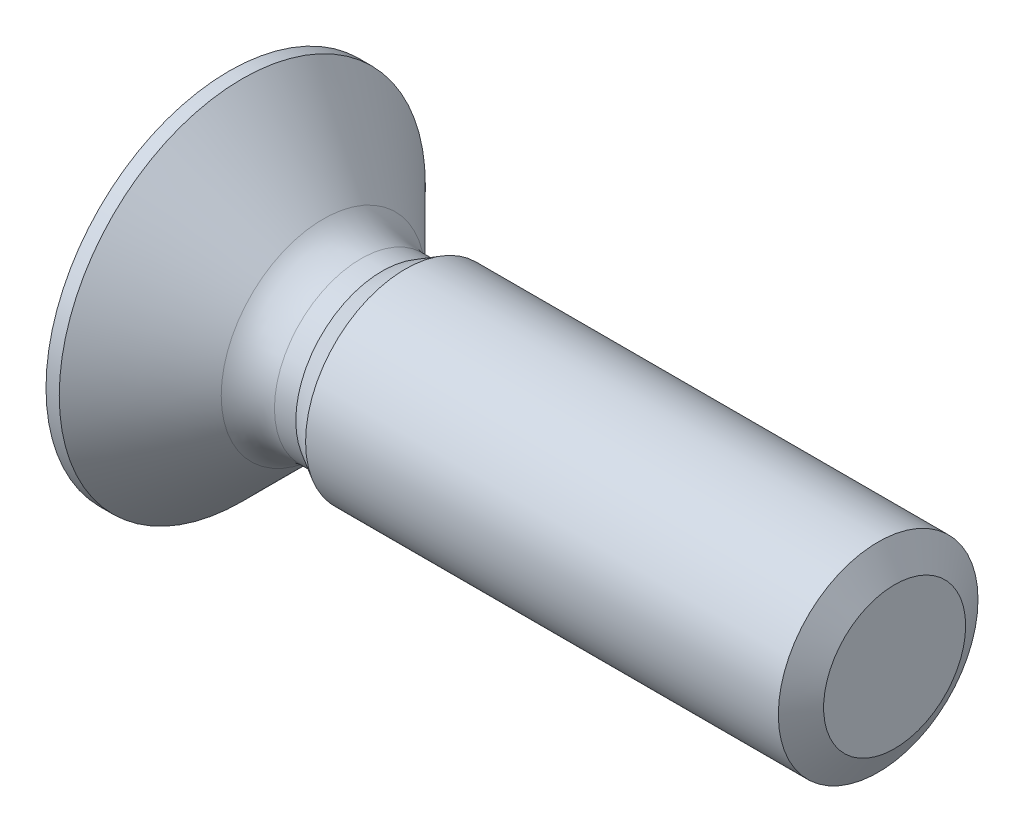
ISO-10303-21;
HEADER;
FILE_DESCRIPTION(('STEP AP214'),'2;1');
FILE_NAME('part.step','',(''),(''),'','','');
FILE_SCHEMA(('AUTOMOTIVE_DESIGN { 1 0 10303 214 1 1 1 1 }'));
ENDSEC;
DATA;
#1=APPLICATION_CONTEXT('core data for automotive mechanical design processes');
#2=APPLICATION_PROTOCOL_DEFINITION('international standard','automotive_design',2000,#1);
#3=PRODUCT_CONTEXT('',#1,'mechanical');
#4=PRODUCT('Part','Part','',(#3));
#5=PRODUCT_RELATED_PRODUCT_CATEGORY('part','',(#4));
#6=PRODUCT_DEFINITION_FORMATION('','',#4);
#7=PRODUCT_DEFINITION_CONTEXT('part definition',#1,'design');
#8=PRODUCT_DEFINITION('design','',#6,#7);
#9=PRODUCT_DEFINITION_SHAPE('','',#8);
#10=(LENGTH_UNIT() NAMED_UNIT(*) SI_UNIT(.MILLI.,.METRE.));
#11=(NAMED_UNIT(*) PLANE_ANGLE_UNIT() SI_UNIT($,.RADIAN.));
#12=(NAMED_UNIT(*) SI_UNIT($,.STERADIAN.) SOLID_ANGLE_UNIT());
#13=UNCERTAINTY_MEASURE_WITH_UNIT(LENGTH_MEASURE(1.E-05),#10,'distance_accuracy_value','');
#14=(GEOMETRIC_REPRESENTATION_CONTEXT(3) GLOBAL_UNCERTAINTY_ASSIGNED_CONTEXT((#13)) GLOBAL_UNIT_ASSIGNED_CONTEXT((#10,
#11,#12)) REPRESENTATION_CONTEXT('',''));
#15=CARTESIAN_POINT('',(0.,0.,0.));
#16=DIRECTION('',(0.,0.,1.));
#17=DIRECTION('',(1.,0.,0.));
#18=AXIS2_PLACEMENT_3D('',#15,#16,#17);
#19=CARTESIAN_POINT('',(0.,0.,0.));
#20=DIRECTION('',(1.,0.,0.));
#21=DIRECTION('',(0.,0.,-1.));
#22=AXIS2_PLACEMENT_3D('',#19,#20,#21);
#23=PLANE('',#22);
#24=CARTESIAN_POINT('',(0.,0.,0.));
#25=DIRECTION('',(-1.,0.,0.));
#26=DIRECTION('',(0.,0.,1.));
#27=AXIS2_PLACEMENT_3D('',#24,#25,#26);
#28=CIRCLE('',#27,2.75);
#29=CARTESIAN_POINT('',(0.,0.,2.75));
#30=VERTEX_POINT('',#29);
#31=EDGE_CURVE('E182',#30,#30,#28,.T.);
#32=ORIENTED_EDGE('',*,*,#31,.T.);
#33=EDGE_LOOP('',(#32));
#34=FACE_BOUND('',#33,.T.);
#35=DIRECTION('',(0.,1.,0.));
#36=VECTOR('',#35,1.);
#37=CARTESIAN_POINT('',(0.,1.6,0.250000000000006));
#38=LINE('',#37,#36);
#39=CARTESIAN_POINT('',(0.,0.25,0.250000000000001));
#40=VERTEX_POINT('',#39);
#41=CARTESIAN_POINT('',(0.,1.6,0.250000000000006));
#42=VERTEX_POINT('',#41);
#43=EDGE_CURVE('E104',#40,#42,#38,.T.);
#44=ORIENTED_EDGE('',*,*,#43,.F.);
#45=DIRECTION('',(0.,0.,-1.));
#46=VECTOR('',#45,1.);
#47=CARTESIAN_POINT('',(0.,0.25,-1.6));
#48=LINE('',#47,#46);
#49=CARTESIAN_POINT('',(0.,0.25,1.6));
#50=VERTEX_POINT('',#49);
#51=EDGE_CURVE('E149',#50,#40,#48,.T.);
#52=ORIENTED_EDGE('',*,*,#51,.F.);
#53=DIRECTION('',(0.,1.,0.));
#54=VECTOR('',#53,1.);
#55=CARTESIAN_POINT('',(0.,0.25,1.6));
#56=LINE('',#55,#54);
#57=CARTESIAN_POINT('',(0.,-0.25,1.6));
#58=VERTEX_POINT('',#57);
#59=EDGE_CURVE('E146',#58,#50,#56,.T.);
#60=ORIENTED_EDGE('',*,*,#59,.F.);
#61=DIRECTION('',(0.,0.,1.));
#62=VECTOR('',#61,1.);
#63=CARTESIAN_POINT('',(0.,-0.25,-1.6));
#64=LINE('',#63,#62);
#65=CARTESIAN_POINT('',(0.,-0.25,0.249999999999999));
#66=VERTEX_POINT('',#65);
#67=EDGE_CURVE('E77',#66,#58,#64,.T.);
#68=ORIENTED_EDGE('',*,*,#67,.F.);
#69=CARTESIAN_POINT('',(0.,-1.6,0.249999999999994));
#70=VERTEX_POINT('',#69);
#71=EDGE_CURVE('E112',#70,#66,#38,.T.);
#72=ORIENTED_EDGE('',*,*,#71,.F.);
#73=DIRECTION('',(0.,0.,1.));
#74=VECTOR('',#73,1.);
#75=CARTESIAN_POINT('',(0.,-1.6,0.249999999999994));
#76=LINE('',#75,#74);
#77=CARTESIAN_POINT('',(0.,-1.6,-0.250000000000006));
#78=VERTEX_POINT('',#77);
#79=EDGE_CURVE('E113',#78,#70,#76,.T.);
#80=ORIENTED_EDGE('',*,*,#79,.F.);
#81=DIRECTION('',(0.,-1.,0.));
#82=VECTOR('',#81,1.);
#83=CARTESIAN_POINT('',(0.,1.6,-0.249999999999994));
#84=LINE('',#83,#82);
#85=CARTESIAN_POINT('',(0.,-0.25,-0.250000000000001));
#86=VERTEX_POINT('',#85);
#87=EDGE_CURVE('E126',#86,#78,#84,.T.);
#88=ORIENTED_EDGE('',*,*,#87,.F.);
#89=CARTESIAN_POINT('',(0.,-0.25,-1.6));
#90=VERTEX_POINT('',#89);
#91=EDGE_CURVE('E143',#90,#86,#64,.T.);
#92=ORIENTED_EDGE('',*,*,#91,.F.);
#93=DIRECTION('',(0.,-1.,0.));
#94=VECTOR('',#93,1.);
#95=CARTESIAN_POINT('',(0.,0.25,-1.6));
#96=LINE('',#95,#94);
#97=CARTESIAN_POINT('',(0.,0.25,-1.6));
#98=VERTEX_POINT('',#97);
#99=EDGE_CURVE('E54',#98,#90,#96,.T.);
#100=ORIENTED_EDGE('',*,*,#99,.F.);
#101=CARTESIAN_POINT('',(0.,0.25,-0.249999999999999));
#102=VERTEX_POINT('',#101);
#103=EDGE_CURVE('E152',#102,#98,#48,.T.);
#104=ORIENTED_EDGE('',*,*,#103,.F.);
#105=CARTESIAN_POINT('',(0.,1.6,-0.249999999999994));
#106=VERTEX_POINT('',#105);
#107=EDGE_CURVE('E125',#106,#102,#84,.T.);
#108=ORIENTED_EDGE('',*,*,#107,.F.);
#109=DIRECTION('',(0.,0.,-1.));
#110=VECTOR('',#109,1.);
#111=CARTESIAN_POINT('',(0.,1.6,0.250000000000006));
#112=LINE('',#111,#110);
#113=EDGE_CURVE('E118',#42,#106,#112,.T.);
#114=ORIENTED_EDGE('',*,*,#113,.F.);
#115=EDGE_LOOP('',(#44,#52,#60,#68,#72,#80,#88,#92,#100,#104,#108,#114));
#116=FACE_BOUND('',#115,.T.);
#117=ADVANCED_FACE('F40',(#34,#116),#23,.F.);
#118=CARTESIAN_POINT('',(2.1,0.,0.));
#119=DIRECTION('',(-0.118212889785112,-0.992988274194944,0.));
#120=DIRECTION('',(0.992988274194944,-0.118212889785112,0.));
#121=AXIS2_PLACEMENT_3D('',#118,#119,#120);
#122=PLANE('',#121);
#123=ORIENTED_EDGE('',*,*,#51,.T.);
#124=DIRECTION('',(0.986122002690152,-0.117395476510732,-0.117395476510733));
#125=VECTOR('',#124,1.);
#126=CARTESIAN_POINT('',(2.1,0.,0.));
#127=LINE('',#126,#125);
#128=CARTESIAN_POINT('',(2.1,0.,0.));
#129=VERTEX_POINT('',#128);
#130=EDGE_CURVE('E83',#40,#129,#127,.T.);
#131=ORIENTED_EDGE('',*,*,#130,.T.);
#132=DIRECTION('',(0.791889207905293,-0.0942725247506301,-0.603344158404032));
#133=VECTOR('',#132,1.);
#134=CARTESIAN_POINT('',(0.,0.25,1.6));
#135=LINE('',#134,#133);
#136=EDGE_CURVE('E63',#50,#129,#135,.T.);
#137=ORIENTED_EDGE('',*,*,#136,.F.);
#138=EDGE_LOOP('',(#123,#131,#137));
#139=FACE_BOUND('',#138,.T.);
#140=ADVANCED_FACE('F198',(#139),#122,.T.);
#141=DIRECTION('',(0.791889207905293,-0.0942725247506301,0.603344158404032));
#142=VECTOR('',#141,1.);
#143=CARTESIAN_POINT('',(0.,0.25,-1.6));
#144=LINE('',#143,#142);
#145=EDGE_CURVE('E148',#98,#129,#144,.T.);
#146=ORIENTED_EDGE('',*,*,#145,.T.);
#147=DIRECTION('',(-0.986122002690152,0.117395476510732,-0.117395476510732));
#148=VECTOR('',#147,1.);
#149=CARTESIAN_POINT('',(2.1,0.,0.));
#150=LINE('',#149,#148);
#151=EDGE_CURVE('E130',#129,#102,#150,.T.);
#152=ORIENTED_EDGE('',*,*,#151,.T.);
#153=ORIENTED_EDGE('',*,*,#103,.T.);
#154=EDGE_LOOP('',(#146,#152,#153));
#155=FACE_BOUND('',#154,.T.);
#156=ADVANCED_FACE('F192',(#155),#122,.T.);
#157=CARTESIAN_POINT('',(2.1,0.,0.));
#158=DIRECTION('',(-0.118212889785112,0.992988274194944,0.));
#159=DIRECTION('',(-0.992988274194944,-0.118212889785112,0.));
#160=AXIS2_PLACEMENT_3D('',#157,#158,#159);
#161=PLANE('',#160);
#162=DIRECTION('',(0.791889207905293,0.0942725247506301,-0.603344158404032));
#163=VECTOR('',#162,1.);
#164=CARTESIAN_POINT('',(0.,-0.25,1.6));
#165=LINE('',#164,#163);
#166=EDGE_CURVE('E142',#58,#129,#165,.T.);
#167=ORIENTED_EDGE('',*,*,#166,.T.);
#168=DIRECTION('',(-0.986122002690152,-0.117395476510732,0.117395476510732));
#169=VECTOR('',#168,1.);
#170=CARTESIAN_POINT('',(2.1,0.,0.));
#171=LINE('',#170,#169);
#172=EDGE_CURVE('E11',#129,#66,#171,.T.);
#173=ORIENTED_EDGE('',*,*,#172,.T.);
#174=ORIENTED_EDGE('',*,*,#67,.T.);
#175=EDGE_LOOP('',(#167,#173,#174));
#176=FACE_BOUND('',#175,.T.);
#177=ADVANCED_FACE('F193',(#176),#161,.T.);
#178=ORIENTED_EDGE('',*,*,#91,.T.);
#179=DIRECTION('',(0.986122002690152,0.117395476510732,0.117395476510733));
#180=VECTOR('',#179,1.);
#181=CARTESIAN_POINT('',(2.1,0.,0.));
#182=LINE('',#181,#180);
#183=EDGE_CURVE('E47',#86,#129,#182,.T.);
#184=ORIENTED_EDGE('',*,*,#183,.T.);
#185=DIRECTION('',(0.791889207905293,0.0942725247506301,0.603344158404032));
#186=VECTOR('',#185,1.);
#187=CARTESIAN_POINT('',(0.,-0.25,-1.6));
#188=LINE('',#187,#186);
#189=EDGE_CURVE('E157',#90,#129,#188,.T.);
#190=ORIENTED_EDGE('',*,*,#189,.F.);
#191=EDGE_LOOP('',(#178,#184,#190));
#192=FACE_BOUND('',#191,.T.);
#193=ADVANCED_FACE('F186',(#192),#161,.T.);
#194=CARTESIAN_POINT('',(0.,0.,0.));
#195=DIRECTION('',(-1.,0.,0.));
#196=DIRECTION('',(0.,0.,1.));
#197=AXIS2_PLACEMENT_3D('',#194,#195,#196);
#198=CYLINDRICAL_SURFACE('',#197,2.75);
#199=ORIENTED_EDGE('',*,*,#31,.F.);
#200=EDGE_LOOP('',(#199));
#201=FACE_BOUND('',#200,.T.);
#202=CARTESIAN_POINT('',(0.199000000000005,0.,0.));
#203=DIRECTION('',(-1.,0.,0.));
#204=DIRECTION('',(0.,0.,1.));
#205=AXIS2_PLACEMENT_3D('',#202,#203,#204);
#206=CIRCLE('',#205,2.75);
#207=CARTESIAN_POINT('',(0.199000000000005,0.,2.75));
#208=VERTEX_POINT('',#207);
#209=EDGE_CURVE('E178',#208,#208,#206,.T.);
#210=ORIENTED_EDGE('',*,*,#209,.T.);
#211=EDGE_LOOP('',(#210));
#212=FACE_BOUND('',#211,.T.);
#213=ADVANCED_FACE('F226',(#201,#212),#198,.T.);
#214=CARTESIAN_POINT('',(1.41568542494924,0.,0.));
#215=DIRECTION('',(-1.,0.,0.));
#216=DIRECTION('',(0.,0.,1.));
#217=AXIS2_PLACEMENT_3D('',#214,#215,#216);
#218=CONICAL_SURFACE('',#217,1.53331457505076,0.78539816339745);
#219=ORIENTED_EDGE('',*,*,#209,.F.);
#220=EDGE_LOOP('',(#219));
#221=FACE_BOUND('',#220,.T.);
#222=CARTESIAN_POINT('',(1.41568542494924,0.,0.));
#223=DIRECTION('',(-1.,0.,0.));
#224=DIRECTION('',(0.,0.,1.));
#225=AXIS2_PLACEMENT_3D('',#222,#223,#224);
#226=CIRCLE('',#225,1.53331457505076);
#227=CARTESIAN_POINT('',(1.41568542494924,0.,1.53331457505076));
#228=VERTEX_POINT('',#227);
#229=EDGE_CURVE('E174',#228,#228,#226,.T.);
#230=ORIENTED_EDGE('',*,*,#229,.T.);
#231=EDGE_LOOP('',(#230));
#232=FACE_BOUND('',#231,.T.);
#233=ADVANCED_FACE('F229',(#221,#232),#218,.T.);
#234=CARTESIAN_POINT('',(1.98137084989848,0.,0.));
#235=DIRECTION('',(-1.,0.,0.));
#236=DIRECTION('',(0.,0.,1.));
#237=AXIS2_PLACEMENT_3D('',#234,#235,#236);
#238=TOROIDAL_SURFACE('',#237,2.099,0.8);
#239=ORIENTED_EDGE('',*,*,#229,.F.);
#240=EDGE_LOOP('',(#239));
#241=FACE_BOUND('',#240,.T.);
#242=CARTESIAN_POINT('',(1.98137084989848,0.,0.));
#243=DIRECTION('',(-1.,0.,0.));
#244=DIRECTION('',(0.,0.,1.));
#245=AXIS2_PLACEMENT_3D('',#242,#243,#244);
#246=CIRCLE('',#245,1.299);
#247=CARTESIAN_POINT('',(1.98137084989848,0.,1.299));
#248=VERTEX_POINT('',#247);
#249=EDGE_CURVE('E171',#248,#248,#246,.T.);
#250=ORIENTED_EDGE('',*,*,#249,.T.);
#251=EDGE_LOOP('',(#250));
#252=FACE_BOUND('',#251,.T.);
#253=ADVANCED_FACE('F234',(#241,#252),#238,.F.);
#254=CARTESIAN_POINT('',(0.,0.,0.));
#255=DIRECTION('',(-1.,0.,0.));
#256=DIRECTION('',(0.,0.,1.));
#257=AXIS2_PLACEMENT_3D('',#254,#255,#256);
#258=CYLINDRICAL_SURFACE('',#257,1.299);
#259=ORIENTED_EDGE('',*,*,#249,.F.);
#260=EDGE_LOOP('',(#259));
#261=FACE_BOUND('',#260,.T.);
#262=CARTESIAN_POINT('',(2.30185778767866,0.,0.));
#263=DIRECTION('',(-1.,0.,0.));
#264=DIRECTION('',(0.,0.,1.));
#265=AXIS2_PLACEMENT_3D('',#262,#263,#264);
#266=CIRCLE('',#265,1.299);
#267=CARTESIAN_POINT('',(2.30185778767866,0.,1.299));
#268=VERTEX_POINT('',#267);
#269=EDGE_CURVE('E168',#268,#268,#266,.T.);
#270=ORIENTED_EDGE('',*,*,#269,.T.);
#271=EDGE_LOOP('',(#270));
#272=FACE_BOUND('',#271,.T.);
#273=ADVANCED_FACE('F240',(#261,#272),#258,.T.);
#274=CARTESIAN_POINT('',(2.65,0.,0.));
#275=DIRECTION('',(1.,0.,0.));
#276=DIRECTION('',(0.,0.,-1.));
#277=AXIS2_PLACEMENT_3D('',#274,#275,#276);
#278=CONICAL_SURFACE('',#277,1.5,0.5235987755983);
#279=ORIENTED_EDGE('',*,*,#269,.F.);
#280=EDGE_LOOP('',(#279));
#281=FACE_BOUND('',#280,.T.);
#282=CARTESIAN_POINT('',(2.65,0.,0.));
#283=DIRECTION('',(-1.,0.,0.));
#284=DIRECTION('',(0.,0.,1.));
#285=AXIS2_PLACEMENT_3D('',#282,#283,#284);
#286=CIRCLE('',#285,1.5);
#287=CARTESIAN_POINT('',(2.65,0.,1.5));
#288=VERTEX_POINT('',#287);
#289=EDGE_CURVE('E165',#288,#288,#286,.T.);
#290=ORIENTED_EDGE('',*,*,#289,.T.);
#291=EDGE_LOOP('',(#290));
#292=FACE_BOUND('',#291,.T.);
#293=ADVANCED_FACE('F246',(#281,#292),#278,.T.);
#294=CARTESIAN_POINT('',(0.,0.,0.));
#295=DIRECTION('',(-1.,0.,0.));
#296=DIRECTION('',(0.,0.,1.));
#297=AXIS2_PLACEMENT_3D('',#294,#295,#296);
#298=CYLINDRICAL_SURFACE('',#297,1.5);
#299=CARTESIAN_POINT('',(9.75270800287124,0.,0.));
#300=DIRECTION('',(1.,0.,0.));
#301=DIRECTION('',(0.,0.,-1.));
#302=AXIS2_PLACEMENT_3D('',#299,#300,#301);
#303=CIRCLE('',#302,1.5);
#304=CARTESIAN_POINT('',(9.75270800287124,0.,-1.5));
#305=VERTEX_POINT('',#304);
#306=EDGE_CURVE('E162',#305,#305,#303,.T.);
#307=ORIENTED_EDGE('',*,*,#306,.F.);
#308=EDGE_LOOP('',(#307));
#309=FACE_BOUND('',#308,.T.);
#310=ORIENTED_EDGE('',*,*,#289,.F.);
#311=EDGE_LOOP('',(#310));
#312=FACE_BOUND('',#311,.T.);
#313=ADVANCED_FACE('F252',(#309,#312),#298,.T.);
#314=CARTESIAN_POINT('',(9.75270800287124,0.,0.));
#315=DIRECTION('',(-1.,0.,0.));
#316=DIRECTION('',(0.,0.,1.));
#317=AXIS2_PLACEMENT_3D('',#314,#315,#316);
#318=CONICAL_SURFACE('',#317,1.5,1.05188801855135);
#319=CARTESIAN_POINT('',(10.,0.,0.));
#320=DIRECTION('',(1.,0.,0.));
#321=DIRECTION('',(0.,0.,-1.));
#322=AXIS2_PLACEMENT_3D('',#319,#320,#321);
#323=CIRCLE('',#322,1.067);
#324=CARTESIAN_POINT('',(10.,0.,-1.067));
#325=VERTEX_POINT('',#324);
#326=EDGE_CURVE('E151',#325,#325,#323,.T.);
#327=ORIENTED_EDGE('',*,*,#326,.F.);
#328=EDGE_LOOP('',(#327));
#329=FACE_BOUND('',#328,.T.);
#330=ORIENTED_EDGE('',*,*,#306,.T.);
#331=EDGE_LOOP('',(#330));
#332=FACE_BOUND('',#331,.T.);
#333=ADVANCED_FACE('F257',(#329,#332),#318,.T.);
#334=CARTESIAN_POINT('',(10.,1.5,0.));
#335=DIRECTION('',(-1.,0.,0.));
#336=DIRECTION('',(0.,0.,1.));
#337=AXIS2_PLACEMENT_3D('',#334,#335,#336);
#338=PLANE('',#337);
#339=ORIENTED_EDGE('',*,*,#326,.T.);
#340=EDGE_LOOP('',(#339));
#341=FACE_BOUND('',#340,.T.);
#342=ADVANCED_FACE('F263',(#341),#338,.F.);
#343=CARTESIAN_POINT('',(0.,0.25,-1.6));
#344=DIRECTION('',(0.606043215262856,0.,-0.795431720032499));
#345=DIRECTION('',(-0.795431720032499,0.,-0.606043215262856));
#346=AXIS2_PLACEMENT_3D('',#343,#344,#345);
#347=PLANE('',#346);
#348=ORIENTED_EDGE('',*,*,#145,.F.);
#349=ORIENTED_EDGE('',*,*,#99,.T.);
#350=ORIENTED_EDGE('',*,*,#189,.T.);
#351=EDGE_LOOP('',(#348,#349,#350));
#352=FACE_BOUND('',#351,.T.);
#353=ADVANCED_FACE('F190',(#352),#347,.F.);
#354=CARTESIAN_POINT('',(0.,-0.25,1.6));
#355=DIRECTION('',(0.606043215262856,0.,0.795431720032499));
#356=DIRECTION('',(0.795431720032499,0.,-0.606043215262856));
#357=AXIS2_PLACEMENT_3D('',#354,#355,#356);
#358=PLANE('',#357);
#359=ORIENTED_EDGE('',*,*,#166,.F.);
#360=ORIENTED_EDGE('',*,*,#59,.T.);
#361=ORIENTED_EDGE('',*,*,#136,.T.);
#362=EDGE_LOOP('',(#359,#360,#361));
#363=FACE_BOUND('',#362,.T.);
#364=ADVANCED_FACE('F197',(#363),#358,.F.);
#365=CARTESIAN_POINT('',(2.1,0.,0.));
#366=DIRECTION('',(-0.118212889785112,0.,-0.992988274194944));
#367=DIRECTION('',(0.992988274194944,0.,-0.118212889785112));
#368=AXIS2_PLACEMENT_3D('',#365,#366,#367);
#369=PLANE('',#368);
#370=DIRECTION('',(0.791889207905293,0.603344158404033,-0.0942725247506279));
#371=VECTOR('',#370,1.);
#372=CARTESIAN_POINT('',(0.,-1.6,0.249999999999994));
#373=LINE('',#372,#371);
#374=EDGE_CURVE('E122',#70,#129,#373,.T.);
#375=ORIENTED_EDGE('',*,*,#374,.F.);
#376=ORIENTED_EDGE('',*,*,#71,.T.);
#377=ORIENTED_EDGE('',*,*,#172,.F.);
#378=EDGE_LOOP('',(#375,#376,#377));
#379=FACE_BOUND('',#378,.T.);
#380=ADVANCED_FACE('F202',(#379),#369,.T.);
#381=CARTESIAN_POINT('',(2.1,0.,0.));
#382=DIRECTION('',(-0.118212889785112,0.,0.992988274194944));
#383=DIRECTION('',(-0.992988274194944,0.,-0.118212889785112));
#384=AXIS2_PLACEMENT_3D('',#381,#382,#383);
#385=PLANE('',#384);
#386=ORIENTED_EDGE('',*,*,#87,.T.);
#387=DIRECTION('',(0.791889207905293,0.603344158404032,0.0942725247506322));
#388=VECTOR('',#387,1.);
#389=CARTESIAN_POINT('',(0.,-1.6,-0.250000000000006));
#390=LINE('',#389,#388);
#391=EDGE_CURVE('E136',#78,#129,#390,.T.);
#392=ORIENTED_EDGE('',*,*,#391,.T.);
#393=ORIENTED_EDGE('',*,*,#183,.F.);
#394=EDGE_LOOP('',(#386,#392,#393));
#395=FACE_BOUND('',#394,.T.);
#396=ADVANCED_FACE('F206',(#395),#385,.T.);
#397=CARTESIAN_POINT('',(0.,-1.6,-0.250000000000006));
#398=DIRECTION('',(0.606043215262856,-0.795431720032499,0.));
#399=DIRECTION('',(0.795431720032499,0.606043215262856,0.));
#400=AXIS2_PLACEMENT_3D('',#397,#398,#399);
#401=PLANE('',#400);
#402=ORIENTED_EDGE('',*,*,#391,.F.);
#403=ORIENTED_EDGE('',*,*,#79,.T.);
#404=ORIENTED_EDGE('',*,*,#374,.T.);
#405=EDGE_LOOP('',(#402,#403,#404));
#406=FACE_BOUND('',#405,.T.);
#407=ADVANCED_FACE('F205',(#406),#401,.F.);
#408=ORIENTED_EDGE('',*,*,#43,.T.);
#409=DIRECTION('',(0.791889207905293,-0.603344158404032,-0.0942725247506322));
#410=VECTOR('',#409,1.);
#411=CARTESIAN_POINT('',(0.,1.6,0.250000000000006));
#412=LINE('',#411,#410);
#413=EDGE_CURVE('E107',#42,#129,#412,.T.);
#414=ORIENTED_EDGE('',*,*,#413,.T.);
#415=ORIENTED_EDGE('',*,*,#130,.F.);
#416=EDGE_LOOP('',(#408,#414,#415));
#417=FACE_BOUND('',#416,.T.);
#418=ADVANCED_FACE('F106',(#417),#369,.T.);
#419=DIRECTION('',(0.791889207905293,-0.603344158404033,0.0942725247506279));
#420=VECTOR('',#419,1.);
#421=CARTESIAN_POINT('',(0.,1.6,-0.249999999999994));
#422=LINE('',#421,#420);
#423=EDGE_CURVE('E120',#106,#129,#422,.T.);
#424=ORIENTED_EDGE('',*,*,#423,.F.);
#425=ORIENTED_EDGE('',*,*,#107,.T.);
#426=ORIENTED_EDGE('',*,*,#151,.F.);
#427=EDGE_LOOP('',(#424,#425,#426));
#428=FACE_BOUND('',#427,.T.);
#429=ADVANCED_FACE('F209',(#428),#385,.T.);
#430=CARTESIAN_POINT('',(0.,1.6,0.250000000000006));
#431=DIRECTION('',(0.606043215262856,0.795431720032499,0.));
#432=DIRECTION('',(-0.795431720032499,0.606043215262856,0.));
#433=AXIS2_PLACEMENT_3D('',#430,#431,#432);
#434=PLANE('',#433);
#435=ORIENTED_EDGE('',*,*,#413,.F.);
#436=ORIENTED_EDGE('',*,*,#113,.T.);
#437=ORIENTED_EDGE('',*,*,#423,.T.);
#438=EDGE_LOOP('',(#435,#436,#437));
#439=FACE_BOUND('',#438,.T.);
#440=ADVANCED_FACE('F117',(#439),#434,.F.);
#441=CLOSED_SHELL('',(#117,#140,#156,#177,#193,#213,#233,#253,#273,#293,#313,#333,#342,#353,
#364,#380,#396,#407,#418,#429,#440));
#442=MANIFOLD_SOLID_BREP('B2',#441);
#443=ADVANCED_BREP_SHAPE_REPRESENTATION('',(#18,#442),#14);
#444=SHAPE_DEFINITION_REPRESENTATION(#9,#443);
ENDSEC;
END-ISO-10303-21;
